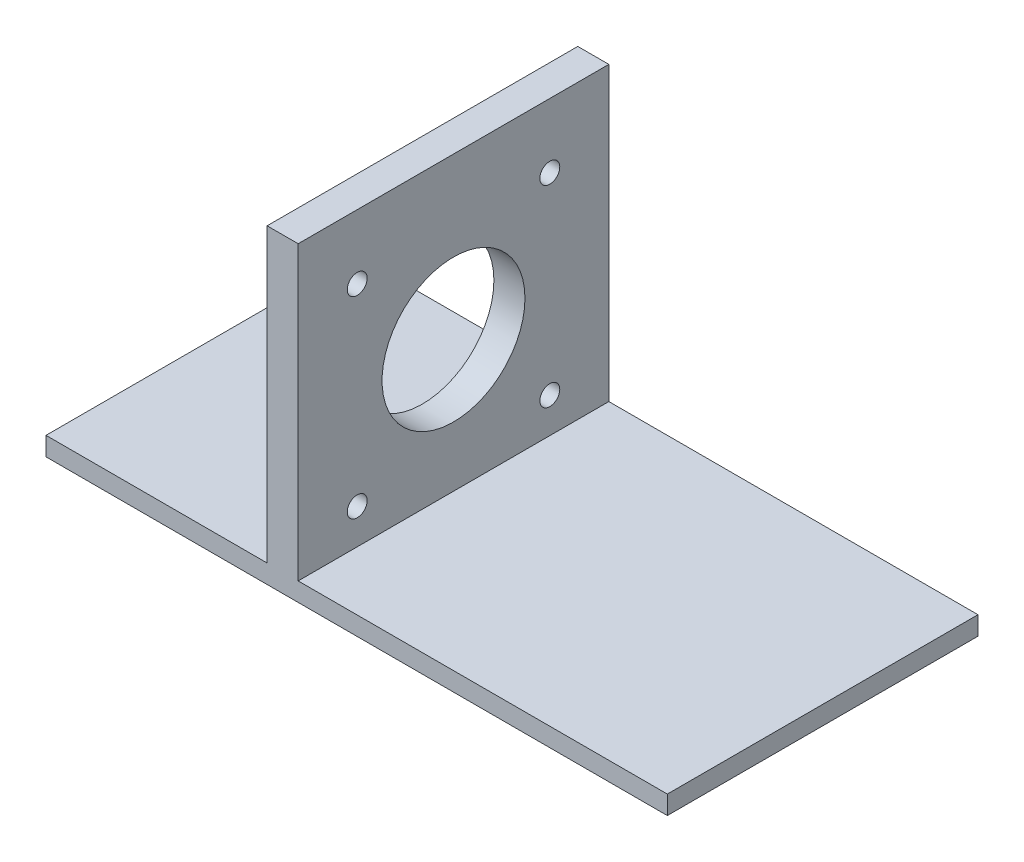
ISO-10303-21;
HEADER;
FILE_DESCRIPTION(('STEP AP214'),'2;1');
FILE_NAME('part.step','',(''),(''),'','','');
FILE_SCHEMA(('AUTOMOTIVE_DESIGN { 1 0 10303 214 1 1 1 1 }'));
ENDSEC;
DATA;
#1=APPLICATION_CONTEXT('core data for automotive mechanical design processes');
#2=APPLICATION_PROTOCOL_DEFINITION('international standard','automotive_design',2000,#1);
#3=PRODUCT_CONTEXT('',#1,'mechanical');
#4=PRODUCT('Part','Part','',(#3));
#5=PRODUCT_RELATED_PRODUCT_CATEGORY('part','',(#4));
#6=PRODUCT_DEFINITION_FORMATION('','',#4);
#7=PRODUCT_DEFINITION_CONTEXT('part definition',#1,'design');
#8=PRODUCT_DEFINITION('design','',#6,#7);
#9=PRODUCT_DEFINITION_SHAPE('','',#8);
#10=(LENGTH_UNIT() NAMED_UNIT(*) SI_UNIT(.MILLI.,.METRE.));
#11=(NAMED_UNIT(*) PLANE_ANGLE_UNIT() SI_UNIT($,.RADIAN.));
#12=(NAMED_UNIT(*) SI_UNIT($,.STERADIAN.) SOLID_ANGLE_UNIT());
#13=UNCERTAINTY_MEASURE_WITH_UNIT(LENGTH_MEASURE(1.E-05),#10,'distance_accuracy_value','');
#14=(GEOMETRIC_REPRESENTATION_CONTEXT(3) GLOBAL_UNCERTAINTY_ASSIGNED_CONTEXT((#13)) GLOBAL_UNIT_ASSIGNED_CONTEXT((#10,
#11,#12)) REPRESENTATION_CONTEXT('',''));
#15=CARTESIAN_POINT('',(0.,0.,0.));
#16=DIRECTION('',(0.,0.,1.));
#17=DIRECTION('',(1.,0.,0.));
#18=AXIS2_PLACEMENT_3D('',#15,#16,#17);
#19=CARTESIAN_POINT('',(0.,3.,0.));
#20=DIRECTION('',(0.,-1.,0.));
#21=DIRECTION('',(0.,0.,-1.));
#22=AXIS2_PLACEMENT_3D('',#19,#20,#21);
#23=PLANE('',#22);
#24=DIRECTION('',(0.,0.,-1.));
#25=VECTOR('',#24,1.);
#26=CARTESIAN_POINT('',(-9.41296635108957,3.,25.));
#27=LINE('',#26,#25);
#28=CARTESIAN_POINT('',(-9.41296635108957,3.,25.));
#29=VERTEX_POINT('',#28);
#30=CARTESIAN_POINT('',(-9.41296635108957,3.,-25.));
#31=VERTEX_POINT('',#30);
#32=EDGE_CURVE('E60',#29,#31,#27,.T.);
#33=ORIENTED_EDGE('',*,*,#32,.F.);
#34=DIRECTION('',(1.,0.,0.));
#35=VECTOR('',#34,1.);
#36=CARTESIAN_POINT('',(-50.,3.,25.));
#37=LINE('',#36,#35);
#38=CARTESIAN_POINT('',(50.,3.,25.));
#39=VERTEX_POINT('',#38);
#40=EDGE_CURVE('E149',#29,#39,#37,.T.);
#41=ORIENTED_EDGE('',*,*,#40,.T.);
#42=DIRECTION('',(0.,0.,-1.));
#43=VECTOR('',#42,1.);
#44=CARTESIAN_POINT('',(50.,3.,25.));
#45=LINE('',#44,#43);
#46=CARTESIAN_POINT('',(50.,3.,-25.));
#47=VERTEX_POINT('',#46);
#48=EDGE_CURVE('E140',#39,#47,#45,.T.);
#49=ORIENTED_EDGE('',*,*,#48,.T.);
#50=DIRECTION('',(-1.,0.,0.));
#51=VECTOR('',#50,1.);
#52=CARTESIAN_POINT('',(-50.,3.,-25.));
#53=LINE('',#52,#51);
#54=EDGE_CURVE('E145',#47,#31,#53,.T.);
#55=ORIENTED_EDGE('',*,*,#54,.T.);
#56=EDGE_LOOP('',(#33,#41,#49,#55));
#57=FACE_BOUND('',#56,.T.);
#58=ADVANCED_FACE('F43',(#57),#23,.F.);
#59=DIRECTION('',(0.,0.,1.));
#60=VECTOR('',#59,1.);
#61=CARTESIAN_POINT('',(-14.4129663510896,3.,-25.));
#62=LINE('',#61,#60);
#63=CARTESIAN_POINT('',(-14.4129663510896,3.,-25.));
#64=VERTEX_POINT('',#63);
#65=CARTESIAN_POINT('',(-14.4129663510896,3.,25.));
#66=VERTEX_POINT('',#65);
#67=EDGE_CURVE('E68',#64,#66,#62,.T.);
#68=ORIENTED_EDGE('',*,*,#67,.F.);
#69=CARTESIAN_POINT('',(-50.,3.,-25.));
#70=VERTEX_POINT('',#69);
#71=EDGE_CURVE('E143',#64,#70,#53,.T.);
#72=ORIENTED_EDGE('',*,*,#71,.T.);
#73=DIRECTION('',(0.,0.,1.));
#74=VECTOR('',#73,1.);
#75=CARTESIAN_POINT('',(-50.,3.,25.));
#76=LINE('',#75,#74);
#77=CARTESIAN_POINT('',(-50.,3.,25.));
#78=VERTEX_POINT('',#77);
#79=EDGE_CURVE('E147',#70,#78,#76,.T.);
#80=ORIENTED_EDGE('',*,*,#79,.T.);
#81=EDGE_CURVE('E150',#78,#66,#37,.T.);
#82=ORIENTED_EDGE('',*,*,#81,.T.);
#83=EDGE_LOOP('',(#68,#72,#80,#82));
#84=FACE_BOUND('',#83,.T.);
#85=ADVANCED_FACE('F213',(#84),#23,.F.);
#86=CARTESIAN_POINT('',(50.,3.,25.));
#87=DIRECTION('',(-1.,0.,0.));
#88=DIRECTION('',(0.,0.,1.));
#89=AXIS2_PLACEMENT_3D('',#86,#87,#88);
#90=PLANE('',#89);
#91=DIRECTION('',(0.,0.,-1.));
#92=VECTOR('',#91,1.);
#93=CARTESIAN_POINT('',(50.,0.,25.));
#94=LINE('',#93,#92);
#95=CARTESIAN_POINT('',(50.,0.,25.));
#96=VERTEX_POINT('',#95);
#97=CARTESIAN_POINT('',(50.,0.,-25.));
#98=VERTEX_POINT('',#97);
#99=EDGE_CURVE('E131',#96,#98,#94,.T.);
#100=ORIENTED_EDGE('',*,*,#99,.T.);
#101=DIRECTION('',(0.,-1.,0.));
#102=VECTOR('',#101,1.);
#103=CARTESIAN_POINT('',(50.,3.,-25.));
#104=LINE('',#103,#102);
#105=EDGE_CURVE('E11',#47,#98,#104,.T.);
#106=ORIENTED_EDGE('',*,*,#105,.F.);
#107=ORIENTED_EDGE('',*,*,#48,.F.);
#108=DIRECTION('',(0.,-1.,0.));
#109=VECTOR('',#108,1.);
#110=CARTESIAN_POINT('',(50.,3.,25.));
#111=LINE('',#110,#109);
#112=EDGE_CURVE('E151',#39,#96,#111,.T.);
#113=ORIENTED_EDGE('',*,*,#112,.T.);
#114=EDGE_LOOP('',(#100,#106,#107,#113));
#115=FACE_BOUND('',#114,.T.);
#116=ADVANCED_FACE('F45',(#115),#90,.F.);
#117=CARTESIAN_POINT('',(-50.,3.,-25.));
#118=DIRECTION('',(0.,0.,1.));
#119=DIRECTION('',(1.,0.,0.));
#120=AXIS2_PLACEMENT_3D('',#117,#118,#119);
#121=PLANE('',#120);
#122=DIRECTION('',(-1.,0.,0.));
#123=VECTOR('',#122,1.);
#124=CARTESIAN_POINT('',(-50.,0.,-25.));
#125=LINE('',#124,#123);
#126=CARTESIAN_POINT('',(-50.,0.,-25.));
#127=VERTEX_POINT('',#126);
#128=EDGE_CURVE('E134',#98,#127,#125,.T.);
#129=ORIENTED_EDGE('',*,*,#128,.T.);
#130=DIRECTION('',(0.,-1.,0.));
#131=VECTOR('',#130,1.);
#132=CARTESIAN_POINT('',(-50.,3.,-25.));
#133=LINE('',#132,#131);
#134=EDGE_CURVE('E52',#70,#127,#133,.T.);
#135=ORIENTED_EDGE('',*,*,#134,.F.);
#136=ORIENTED_EDGE('',*,*,#71,.F.);
#137=DIRECTION('',(0.,-1.,0.));
#138=VECTOR('',#137,1.);
#139=CARTESIAN_POINT('',(-14.4129663510896,50.,-25.));
#140=LINE('',#139,#138);
#141=CARTESIAN_POINT('',(-14.4129663510896,50.,-25.));
#142=VERTEX_POINT('',#141);
#143=EDGE_CURVE('E116',#142,#64,#140,.T.);
#144=ORIENTED_EDGE('',*,*,#143,.F.);
#145=DIRECTION('',(-1.,0.,0.));
#146=VECTOR('',#145,1.);
#147=CARTESIAN_POINT('',(-9.41296635108957,50.,-25.));
#148=LINE('',#147,#146);
#149=CARTESIAN_POINT('',(-9.41296635108957,50.,-25.));
#150=VERTEX_POINT('',#149);
#151=EDGE_CURVE('E110',#150,#142,#148,.T.);
#152=ORIENTED_EDGE('',*,*,#151,.F.);
#153=DIRECTION('',(0.,-1.,0.));
#154=VECTOR('',#153,1.);
#155=CARTESIAN_POINT('',(-9.41296635108957,50.,-25.));
#156=LINE('',#155,#154);
#157=EDGE_CURVE('E114',#150,#31,#156,.T.);
#158=ORIENTED_EDGE('',*,*,#157,.T.);
#159=ORIENTED_EDGE('',*,*,#54,.F.);
#160=ORIENTED_EDGE('',*,*,#105,.T.);
#161=EDGE_LOOP('',(#129,#135,#136,#144,#152,#158,#159,#160));
#162=FACE_BOUND('',#161,.T.);
#163=ADVANCED_FACE('F112',(#162),#121,.F.);
#164=CARTESIAN_POINT('',(-50.,3.,25.));
#165=DIRECTION('',(1.,0.,0.));
#166=DIRECTION('',(0.,0.,-1.));
#167=AXIS2_PLACEMENT_3D('',#164,#165,#166);
#168=PLANE('',#167);
#169=DIRECTION('',(0.,0.,1.));
#170=VECTOR('',#169,1.);
#171=CARTESIAN_POINT('',(-50.,0.,25.));
#172=LINE('',#171,#170);
#173=CARTESIAN_POINT('',(-50.,0.,25.));
#174=VERTEX_POINT('',#173);
#175=EDGE_CURVE('E154',#127,#174,#172,.T.);
#176=ORIENTED_EDGE('',*,*,#175,.T.);
#177=DIRECTION('',(0.,-1.,0.));
#178=VECTOR('',#177,1.);
#179=CARTESIAN_POINT('',(-50.,3.,25.));
#180=LINE('',#179,#178);
#181=EDGE_CURVE('E159',#78,#174,#180,.T.);
#182=ORIENTED_EDGE('',*,*,#181,.F.);
#183=ORIENTED_EDGE('',*,*,#79,.F.);
#184=ORIENTED_EDGE('',*,*,#134,.T.);
#185=EDGE_LOOP('',(#176,#182,#183,#184));
#186=FACE_BOUND('',#185,.T.);
#187=ADVANCED_FACE('F224',(#186),#168,.F.);
#188=CARTESIAN_POINT('',(-50.,3.,25.));
#189=DIRECTION('',(0.,0.,-1.));
#190=DIRECTION('',(-1.,0.,0.));
#191=AXIS2_PLACEMENT_3D('',#188,#189,#190);
#192=PLANE('',#191);
#193=DIRECTION('',(1.,0.,0.));
#194=VECTOR('',#193,1.);
#195=CARTESIAN_POINT('',(-50.,0.,25.));
#196=LINE('',#195,#194);
#197=EDGE_CURVE('E144',#174,#96,#196,.T.);
#198=ORIENTED_EDGE('',*,*,#197,.T.);
#199=ORIENTED_EDGE('',*,*,#112,.F.);
#200=ORIENTED_EDGE('',*,*,#40,.F.);
#201=DIRECTION('',(0.,-1.,0.));
#202=VECTOR('',#201,1.);
#203=CARTESIAN_POINT('',(-9.41296635108957,50.,25.));
#204=LINE('',#203,#202);
#205=CARTESIAN_POINT('',(-9.41296635108957,50.,25.));
#206=VERTEX_POINT('',#205);
#207=EDGE_CURVE('E190',#206,#29,#204,.T.);
#208=ORIENTED_EDGE('',*,*,#207,.F.);
#209=DIRECTION('',(1.,0.,0.));
#210=VECTOR('',#209,1.);
#211=CARTESIAN_POINT('',(-14.4129663510896,50.,25.));
#212=LINE('',#211,#210);
#213=CARTESIAN_POINT('',(-14.4129663510896,50.,25.));
#214=VERTEX_POINT('',#213);
#215=EDGE_CURVE('E125',#214,#206,#212,.T.);
#216=ORIENTED_EDGE('',*,*,#215,.F.);
#217=DIRECTION('',(0.,-1.,0.));
#218=VECTOR('',#217,1.);
#219=CARTESIAN_POINT('',(-14.4129663510896,50.,25.));
#220=LINE('',#219,#218);
#221=EDGE_CURVE('E136',#214,#66,#220,.T.);
#222=ORIENTED_EDGE('',*,*,#221,.T.);
#223=ORIENTED_EDGE('',*,*,#81,.F.);
#224=ORIENTED_EDGE('',*,*,#181,.T.);
#225=EDGE_LOOP('',(#198,#199,#200,#208,#216,#222,#223,#224));
#226=FACE_BOUND('',#225,.T.);
#227=ADVANCED_FACE('F197',(#226),#192,.F.);
#228=CARTESIAN_POINT('',(0.,0.,0.));
#229=DIRECTION('',(0.,-1.,0.));
#230=DIRECTION('',(0.,0.,-1.));
#231=AXIS2_PLACEMENT_3D('',#228,#229,#230);
#232=PLANE('',#231);
#233=ORIENTED_EDGE('',*,*,#99,.F.);
#234=ORIENTED_EDGE('',*,*,#197,.F.);
#235=ORIENTED_EDGE('',*,*,#175,.F.);
#236=ORIENTED_EDGE('',*,*,#128,.F.);
#237=EDGE_LOOP('',(#233,#234,#235,#236));
#238=FACE_BOUND('',#237,.T.);
#239=ADVANCED_FACE('F209',(#238),#232,.T.);
#240=CARTESIAN_POINT('',(-9.41296635108957,50.,25.));
#241=DIRECTION('',(-1.,0.,0.));
#242=DIRECTION('',(0.,0.,1.));
#243=AXIS2_PLACEMENT_3D('',#240,#241,#242);
#244=PLANE('',#243);
#245=CARTESIAN_POINT('',(-9.41296635108957,8.64999999999718,-15.4999985702817));
#246=DIRECTION('',(1.,0.,0.));
#247=DIRECTION('',(0.,0.,1.));
#248=AXIS2_PLACEMENT_3D('',#245,#246,#247);
#249=CIRCLE('',#248,1.6);
#250=CARTESIAN_POINT('',(-9.41296635108957,8.64999999999718,-13.8999985702817));
#251=VERTEX_POINT('',#250);
#252=EDGE_CURVE('E346',#251,#251,#249,.T.);
#253=ORIENTED_EDGE('',*,*,#252,.F.);
#254=EDGE_LOOP('',(#253));
#255=FACE_BOUND('',#254,.T.);
#256=CARTESIAN_POINT('',(-9.41296635108957,39.6499999999973,-15.4999985702817));
#257=DIRECTION('',(1.,0.,0.));
#258=DIRECTION('',(0.,0.,-1.));
#259=AXIS2_PLACEMENT_3D('',#256,#257,#258);
#260=CIRCLE('',#259,1.6);
#261=CARTESIAN_POINT('',(-9.41296635108957,39.6499999999973,-17.0999985702817));
#262=VERTEX_POINT('',#261);
#263=EDGE_CURVE('E347',#262,#262,#260,.T.);
#264=ORIENTED_EDGE('',*,*,#263,.F.);
#265=EDGE_LOOP('',(#264));
#266=FACE_BOUND('',#265,.T.);
#267=CARTESIAN_POINT('',(-9.41296635108957,39.6499999999973,15.4999985702817));
#268=DIRECTION('',(1.,0.,0.));
#269=DIRECTION('',(0.,0.,1.));
#270=AXIS2_PLACEMENT_3D('',#267,#268,#269);
#271=CIRCLE('',#270,1.6);
#272=CARTESIAN_POINT('',(-9.41296635108957,39.6499999999973,17.0999985702817));
#273=VERTEX_POINT('',#272);
#274=EDGE_CURVE('E349',#273,#273,#271,.T.);
#275=ORIENTED_EDGE('',*,*,#274,.F.);
#276=EDGE_LOOP('',(#275));
#277=FACE_BOUND('',#276,.T.);
#278=CARTESIAN_POINT('',(-9.41296635108957,8.64999999999718,15.4999985702817));
#279=DIRECTION('',(1.,0.,0.));
#280=DIRECTION('',(0.,0.,-1.));
#281=AXIS2_PLACEMENT_3D('',#278,#279,#280);
#282=CIRCLE('',#281,1.6);
#283=CARTESIAN_POINT('',(-9.41296635108957,8.64999999999718,13.8999985702817));
#284=VERTEX_POINT('',#283);
#285=EDGE_CURVE('E172',#284,#284,#282,.T.);
#286=ORIENTED_EDGE('',*,*,#285,.F.);
#287=EDGE_LOOP('',(#286));
#288=FACE_BOUND('',#287,.T.);
#289=CARTESIAN_POINT('',(-9.41296635108957,24.1499999999972,-1.42971823269278E-06));
#290=DIRECTION('',(1.,0.,0.));
#291=DIRECTION('',(0.,0.,-1.));
#292=AXIS2_PLACEMENT_3D('',#289,#290,#291);
#293=CIRCLE('',#292,11.4999999999954);
#294=CARTESIAN_POINT('',(-9.41296635108957,24.1499999999972,-11.5000014297137));
#295=VERTEX_POINT('',#294);
#296=EDGE_CURVE('E167',#295,#295,#293,.T.);
#297=ORIENTED_EDGE('',*,*,#296,.F.);
#298=EDGE_LOOP('',(#297));
#299=FACE_BOUND('',#298,.T.);
#300=ORIENTED_EDGE('',*,*,#32,.T.);
#301=ORIENTED_EDGE('',*,*,#157,.F.);
#302=DIRECTION('',(0.,0.,-1.));
#303=VECTOR('',#302,1.);
#304=CARTESIAN_POINT('',(-9.41296635108957,50.,25.));
#305=LINE('',#304,#303);
#306=EDGE_CURVE('E120',#206,#150,#305,.T.);
#307=ORIENTED_EDGE('',*,*,#306,.F.);
#308=ORIENTED_EDGE('',*,*,#207,.T.);
#309=EDGE_LOOP('',(#300,#301,#307,#308));
#310=FACE_BOUND('',#309,.T.);
#311=ADVANCED_FACE('F130',(#255,#266,#277,#288,#299,#310),#244,.F.);
#312=CARTESIAN_POINT('',(-14.4129663510896,50.,-25.));
#313=DIRECTION('',(1.,0.,0.));
#314=DIRECTION('',(0.,0.,-1.));
#315=AXIS2_PLACEMENT_3D('',#312,#313,#314);
#316=PLANE('',#315);
#317=CARTESIAN_POINT('',(-14.4129663510896,8.64999999999718,-15.4999985702817));
#318=DIRECTION('',(1.,0.,0.));
#319=DIRECTION('',(0.,0.,-1.));
#320=AXIS2_PLACEMENT_3D('',#317,#318,#319);
#321=CIRCLE('',#320,1.6);
#322=CARTESIAN_POINT('',(-14.4129663510896,8.64999999999718,-17.0999985702817));
#323=VERTEX_POINT('',#322);
#324=EDGE_CURVE('E47',#323,#323,#321,.T.);
#325=ORIENTED_EDGE('',*,*,#324,.T.);
#326=EDGE_LOOP('',(#325));
#327=FACE_BOUND('',#326,.T.);
#328=CARTESIAN_POINT('',(-14.4129663510896,39.6499999999973,-15.4999985702817));
#329=DIRECTION('',(1.,0.,0.));
#330=DIRECTION('',(0.,0.,-1.));
#331=AXIS2_PLACEMENT_3D('',#328,#329,#330);
#332=CIRCLE('',#331,1.6);
#333=CARTESIAN_POINT('',(-14.4129663510896,39.6499999999973,-17.0999985702817));
#334=VERTEX_POINT('',#333);
#335=EDGE_CURVE('E174',#334,#334,#332,.T.);
#336=ORIENTED_EDGE('',*,*,#335,.T.);
#337=EDGE_LOOP('',(#336));
#338=FACE_BOUND('',#337,.T.);
#339=CARTESIAN_POINT('',(-14.4129663510896,39.6499999999973,15.4999985702817));
#340=DIRECTION('',(1.,0.,0.));
#341=DIRECTION('',(0.,0.,-1.));
#342=AXIS2_PLACEMENT_3D('',#339,#340,#341);
#343=CIRCLE('',#342,1.6);
#344=CARTESIAN_POINT('',(-14.4129663510896,39.6499999999973,13.8999985702817));
#345=VERTEX_POINT('',#344);
#346=EDGE_CURVE('E171',#345,#345,#343,.T.);
#347=ORIENTED_EDGE('',*,*,#346,.T.);
#348=EDGE_LOOP('',(#347));
#349=FACE_BOUND('',#348,.T.);
#350=CARTESIAN_POINT('',(-14.4129663510896,8.64999999999718,15.4999985702817));
#351=DIRECTION('',(1.,0.,0.));
#352=DIRECTION('',(0.,0.,-1.));
#353=AXIS2_PLACEMENT_3D('',#350,#351,#352);
#354=CIRCLE('',#353,1.6);
#355=CARTESIAN_POINT('',(-14.4129663510896,8.64999999999718,13.8999985702817));
#356=VERTEX_POINT('',#355);
#357=EDGE_CURVE('E168',#356,#356,#354,.T.);
#358=ORIENTED_EDGE('',*,*,#357,.T.);
#359=EDGE_LOOP('',(#358));
#360=FACE_BOUND('',#359,.T.);
#361=CARTESIAN_POINT('',(-14.4129663510896,24.1499999999972,-1.42971823269278E-06));
#362=DIRECTION('',(1.,0.,0.));
#363=DIRECTION('',(0.,0.,-1.));
#364=AXIS2_PLACEMENT_3D('',#361,#362,#363);
#365=CIRCLE('',#364,11.4999999999954);
#366=CARTESIAN_POINT('',(-14.4129663510896,24.1499999999972,-11.5000014297137));
#367=VERTEX_POINT('',#366);
#368=EDGE_CURVE('E164',#367,#367,#365,.T.);
#369=ORIENTED_EDGE('',*,*,#368,.T.);
#370=EDGE_LOOP('',(#369));
#371=FACE_BOUND('',#370,.T.);
#372=ORIENTED_EDGE('',*,*,#67,.T.);
#373=ORIENTED_EDGE('',*,*,#221,.F.);
#374=DIRECTION('',(0.,0.,1.));
#375=VECTOR('',#374,1.);
#376=CARTESIAN_POINT('',(-14.4129663510896,50.,-25.));
#377=LINE('',#376,#375);
#378=EDGE_CURVE('E119',#142,#214,#377,.T.);
#379=ORIENTED_EDGE('',*,*,#378,.F.);
#380=ORIENTED_EDGE('',*,*,#143,.T.);
#381=EDGE_LOOP('',(#372,#373,#379,#380));
#382=FACE_BOUND('',#381,.T.);
#383=ADVANCED_FACE('F199',(#327,#338,#349,#360,#371,#382),#316,.F.);
#384=CARTESIAN_POINT('',(0.,50.,0.));
#385=DIRECTION('',(0.,1.,0.));
#386=DIRECTION('',(0.,0.,1.));
#387=AXIS2_PLACEMENT_3D('',#384,#385,#386);
#388=PLANE('',#387);
#389=ORIENTED_EDGE('',*,*,#306,.T.);
#390=ORIENTED_EDGE('',*,*,#151,.T.);
#391=ORIENTED_EDGE('',*,*,#378,.T.);
#392=ORIENTED_EDGE('',*,*,#215,.T.);
#393=EDGE_LOOP('',(#389,#390,#391,#392));
#394=FACE_BOUND('',#393,.T.);
#395=ADVANCED_FACE('F123',(#394),#388,.T.);
#396=CARTESIAN_POINT('',(-50.,24.1499999999972,-1.42971823269278E-06));
#397=DIRECTION('',(1.,0.,0.));
#398=DIRECTION('',(0.,0.,-1.));
#399=AXIS2_PLACEMENT_3D('',#396,#397,#398);
#400=CYLINDRICAL_SURFACE('',#399,11.4999999999954);
#401=ORIENTED_EDGE('',*,*,#296,.T.);
#402=EDGE_LOOP('',(#401));
#403=FACE_BOUND('',#402,.T.);
#404=ORIENTED_EDGE('',*,*,#368,.F.);
#405=EDGE_LOOP('',(#404));
#406=FACE_BOUND('',#405,.T.);
#407=ADVANCED_FACE('F207',(#403,#406),#400,.F.);
#408=CARTESIAN_POINT('',(-50.,8.64999999999718,15.4999985702817));
#409=DIRECTION('',(1.,0.,0.));
#410=DIRECTION('',(0.,0.,-1.));
#411=AXIS2_PLACEMENT_3D('',#408,#409,#410);
#412=CYLINDRICAL_SURFACE('',#411,1.6);
#413=ORIENTED_EDGE('',*,*,#285,.T.);
#414=EDGE_LOOP('',(#413));
#415=FACE_BOUND('',#414,.T.);
#416=ORIENTED_EDGE('',*,*,#357,.F.);
#417=EDGE_LOOP('',(#416));
#418=FACE_BOUND('',#417,.T.);
#419=ADVANCED_FACE('F302',(#415,#418),#412,.F.);
#420=CARTESIAN_POINT('',(-50.,39.6499999999973,15.4999985702817));
#421=DIRECTION('',(1.,0.,0.));
#422=DIRECTION('',(0.,0.,-1.));
#423=AXIS2_PLACEMENT_3D('',#420,#421,#422);
#424=CYLINDRICAL_SURFACE('',#423,1.6);
#425=ORIENTED_EDGE('',*,*,#274,.T.);
#426=EDGE_LOOP('',(#425));
#427=FACE_BOUND('',#426,.T.);
#428=ORIENTED_EDGE('',*,*,#346,.F.);
#429=EDGE_LOOP('',(#428));
#430=FACE_BOUND('',#429,.T.);
#431=ADVANCED_FACE('F310',(#427,#430),#424,.F.);
#432=CARTESIAN_POINT('',(-50.,39.6499999999973,-15.4999985702817));
#433=DIRECTION('',(1.,0.,0.));
#434=DIRECTION('',(0.,0.,-1.));
#435=AXIS2_PLACEMENT_3D('',#432,#433,#434);
#436=CYLINDRICAL_SURFACE('',#435,1.6);
#437=ORIENTED_EDGE('',*,*,#263,.T.);
#438=EDGE_LOOP('',(#437));
#439=FACE_BOUND('',#438,.T.);
#440=ORIENTED_EDGE('',*,*,#335,.F.);
#441=EDGE_LOOP('',(#440));
#442=FACE_BOUND('',#441,.T.);
#443=ADVANCED_FACE('F320',(#439,#442),#436,.F.);
#444=CARTESIAN_POINT('',(-50.,8.64999999999718,-15.4999985702817));
#445=DIRECTION('',(1.,0.,0.));
#446=DIRECTION('',(0.,0.,-1.));
#447=AXIS2_PLACEMENT_3D('',#444,#445,#446);
#448=CYLINDRICAL_SURFACE('',#447,1.6);
#449=ORIENTED_EDGE('',*,*,#252,.T.);
#450=EDGE_LOOP('',(#449));
#451=FACE_BOUND('',#450,.T.);
#452=ORIENTED_EDGE('',*,*,#324,.F.);
#453=EDGE_LOOP('',(#452));
#454=FACE_BOUND('',#453,.T.);
#455=ADVANCED_FACE('F330',(#451,#454),#448,.F.);
#456=CLOSED_SHELL('',(#58,#85,#116,#163,#187,#227,#239,#311,#383,#395,#407,#419,#431,#443,#455));
#457=MANIFOLD_SOLID_BREP('B2',#456);
#458=ADVANCED_BREP_SHAPE_REPRESENTATION('',(#18,#457),#14);
#459=SHAPE_DEFINITION_REPRESENTATION(#9,#458);
ENDSEC;
END-ISO-10303-21;
